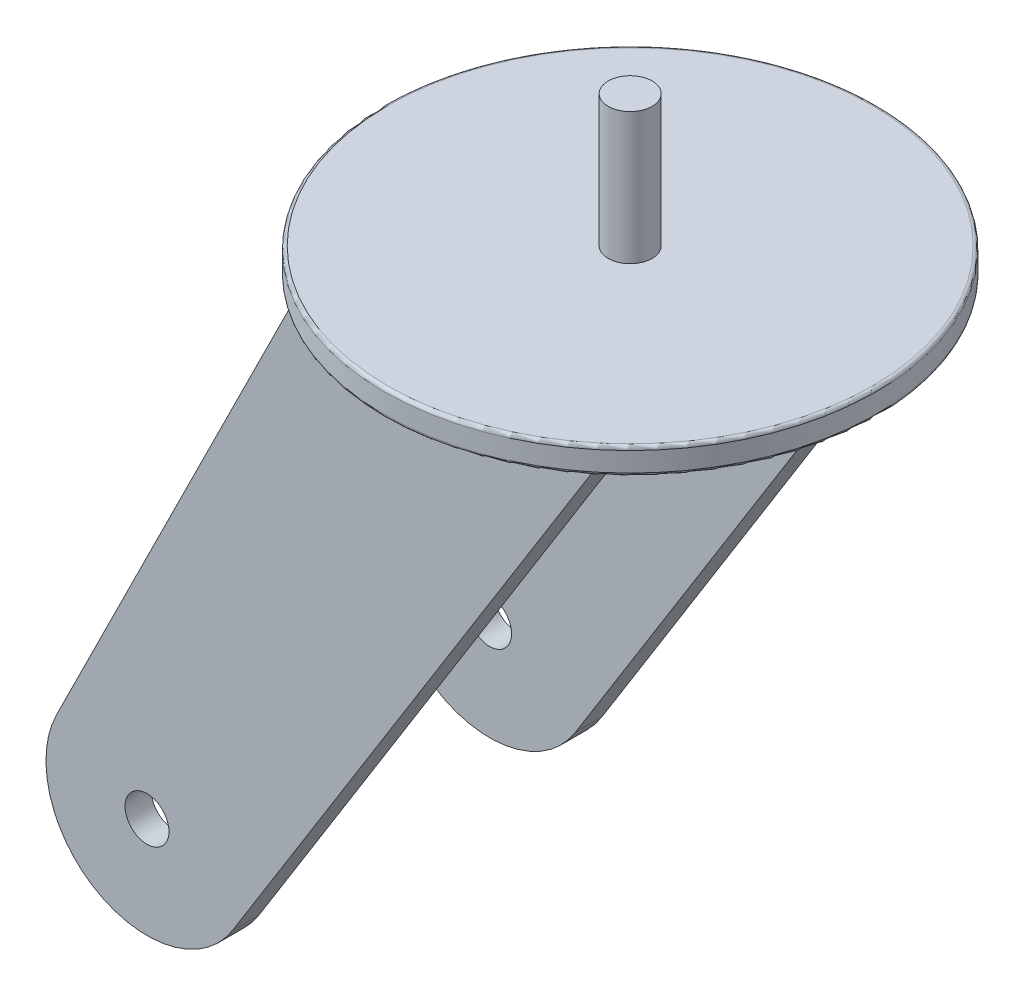
ISO-10303-21;
HEADER;
FILE_DESCRIPTION(('STEP AP214'),'2;1');
FILE_NAME('part.step','',(''),(''),'','','');
FILE_SCHEMA(('AUTOMOTIVE_DESIGN { 1 0 10303 214 1 1 1 1 }'));
ENDSEC;
DATA;
#1=APPLICATION_CONTEXT('core data for automotive mechanical design processes');
#2=APPLICATION_PROTOCOL_DEFINITION('international standard','automotive_design',2000,#1);
#3=PRODUCT_CONTEXT('',#1,'mechanical');
#4=PRODUCT('Part','Part','',(#3));
#5=PRODUCT_RELATED_PRODUCT_CATEGORY('part','',(#4));
#6=PRODUCT_DEFINITION_FORMATION('','',#4);
#7=PRODUCT_DEFINITION_CONTEXT('part definition',#1,'design');
#8=PRODUCT_DEFINITION('design','',#6,#7);
#9=PRODUCT_DEFINITION_SHAPE('','',#8);
#10=(LENGTH_UNIT() NAMED_UNIT(*) SI_UNIT(.MILLI.,.METRE.));
#11=(NAMED_UNIT(*) PLANE_ANGLE_UNIT() SI_UNIT($,.RADIAN.));
#12=(NAMED_UNIT(*) SI_UNIT($,.STERADIAN.) SOLID_ANGLE_UNIT());
#13=UNCERTAINTY_MEASURE_WITH_UNIT(LENGTH_MEASURE(1.E-05),#10,'distance_accuracy_value','');
#14=(GEOMETRIC_REPRESENTATION_CONTEXT(3) GLOBAL_UNCERTAINTY_ASSIGNED_CONTEXT((#13)) GLOBAL_UNIT_ASSIGNED_CONTEXT((#10,
#11,#12)) REPRESENTATION_CONTEXT('',''));
#15=CARTESIAN_POINT('',(0.,0.,0.));
#16=DIRECTION('',(0.,0.,1.));
#17=DIRECTION('',(1.,0.,0.));
#18=AXIS2_PLACEMENT_3D('',#15,#16,#17);
#19=CARTESIAN_POINT('',(0.,0.,0.));
#20=DIRECTION('',(0.,1.,0.));
#21=DIRECTION('',(0.,0.,1.));
#22=AXIS2_PLACEMENT_3D('',#19,#20,#21);
#23=PLANE('',#22);
#24=DIRECTION('',(0.,0.,1.));
#25=VECTOR('',#24,1.);
#26=CARTESIAN_POINT('',(43.18,0.,-53.34));
#27=LINE('',#26,#25);
#28=CARTESIAN_POINT('',(43.18,0.,-53.34));
#29=VERTEX_POINT('',#28);
#30=CARTESIAN_POINT('',(43.18,0.,-45.72));
#31=VERTEX_POINT('',#30);
#32=EDGE_CURVE('E55',#29,#31,#27,.T.);
#33=ORIENTED_EDGE('',*,*,#32,.F.);
#34=DIRECTION('',(-1.,0.,0.));
#35=VECTOR('',#34,1.);
#36=CARTESIAN_POINT('',(0.,0.,-53.34));
#37=LINE('',#36,#35);
#38=CARTESIAN_POINT('',(-43.18,0.,-53.34));
#39=VERTEX_POINT('',#38);
#40=EDGE_CURVE('E59',#29,#39,#37,.T.);
#41=ORIENTED_EDGE('',*,*,#40,.T.);
#42=DIRECTION('',(0.,0.,1.));
#43=VECTOR('',#42,1.);
#44=CARTESIAN_POINT('',(-43.18,0.,-53.34));
#45=LINE('',#44,#43);
#46=CARTESIAN_POINT('',(-43.18,0.,-45.72));
#47=VERTEX_POINT('',#46);
#48=EDGE_CURVE('E129',#39,#47,#45,.T.);
#49=ORIENTED_EDGE('',*,*,#48,.T.);
#50=DIRECTION('',(-1.,0.,0.));
#51=VECTOR('',#50,1.);
#52=CARTESIAN_POINT('',(0.,0.,-45.72));
#53=LINE('',#52,#51);
#54=EDGE_CURVE('E133',#31,#47,#53,.T.);
#55=ORIENTED_EDGE('',*,*,#54,.F.);
#56=EDGE_LOOP('',(#33,#41,#49,#55));
#57=FACE_BOUND('',#56,.T.);
#58=CARTESIAN_POINT('',(0.,0.,0.));
#59=DIRECTION('',(0.,1.,0.));
#60=DIRECTION('',(0.,0.,1.));
#61=AXIS2_PLACEMENT_3D('',#58,#59,#60);
#62=CIRCLE('',#61,70.1294);
#63=CARTESIAN_POINT('',(0.,0.,70.1294));
#64=VERTEX_POINT('',#63);
#65=EDGE_CURVE('E48',#64,#64,#62,.F.);
#66=ORIENTED_EDGE('',*,*,#65,.T.);
#67=EDGE_LOOP('',(#66));
#68=FACE_BOUND('',#67,.T.);
#69=DIRECTION('',(0.,0.,-1.));
#70=VECTOR('',#69,1.);
#71=CARTESIAN_POINT('',(-43.18,0.,53.34));
#72=LINE('',#71,#70);
#73=CARTESIAN_POINT('',(-43.18,0.,53.34));
#74=VERTEX_POINT('',#73);
#75=CARTESIAN_POINT('',(-43.18,0.,45.72));
#76=VERTEX_POINT('',#75);
#77=EDGE_CURVE('E199',#74,#76,#72,.T.);
#78=ORIENTED_EDGE('',*,*,#77,.F.);
#79=DIRECTION('',(-1.,0.,0.));
#80=VECTOR('',#79,1.);
#81=CARTESIAN_POINT('',(0.,0.,53.34));
#82=LINE('',#81,#80);
#83=CARTESIAN_POINT('',(43.18,0.,53.34));
#84=VERTEX_POINT('',#83);
#85=EDGE_CURVE('E162',#84,#74,#82,.T.);
#86=ORIENTED_EDGE('',*,*,#85,.F.);
#87=DIRECTION('',(0.,0.,-1.));
#88=VECTOR('',#87,1.);
#89=CARTESIAN_POINT('',(43.18,0.,53.34));
#90=LINE('',#89,#88);
#91=CARTESIAN_POINT('',(43.18,0.,45.72));
#92=VERTEX_POINT('',#91);
#93=EDGE_CURVE('E177',#84,#92,#90,.T.);
#94=ORIENTED_EDGE('',*,*,#93,.T.);
#95=DIRECTION('',(-1.,0.,0.));
#96=VECTOR('',#95,1.);
#97=CARTESIAN_POINT('',(0.,0.,45.72));
#98=LINE('',#97,#96);
#99=EDGE_CURVE('E167',#92,#76,#98,.T.);
#100=ORIENTED_EDGE('',*,*,#99,.T.);
#101=EDGE_LOOP('',(#78,#86,#94,#100));
#102=FACE_BOUND('',#101,.T.);
#103=ADVANCED_FACE('F39',(#57,#68,#102),#23,.F.);
#104=CARTESIAN_POINT('',(0.,7.62,0.));
#105=DIRECTION('',(0.,-1.,0.));
#106=DIRECTION('',(0.,0.,-1.));
#107=AXIS2_PLACEMENT_3D('',#104,#105,#106);
#108=CYLINDRICAL_SURFACE('',#107,71.12);
#109=CARTESIAN_POINT('',(0.,0.990599999999999,0.));
#110=DIRECTION('',(0.,1.,0.));
#111=DIRECTION('',(0.,0.,1.));
#112=AXIS2_PLACEMENT_3D('',#109,#110,#111);
#113=CIRCLE('',#112,71.12);
#114=CARTESIAN_POINT('',(0.,0.990599999999999,71.12));
#115=VERTEX_POINT('',#114);
#116=EDGE_CURVE('E207',#115,#115,#113,.T.);
#117=ORIENTED_EDGE('',*,*,#116,.T.);
#118=EDGE_LOOP('',(#117));
#119=FACE_BOUND('',#118,.T.);
#120=CARTESIAN_POINT('',(0.,6.6294,0.));
#121=DIRECTION('',(0.,1.,0.));
#122=DIRECTION('',(0.,0.,1.));
#123=AXIS2_PLACEMENT_3D('',#120,#121,#122);
#124=CIRCLE('',#123,71.12);
#125=CARTESIAN_POINT('',(0.,6.6294,71.12));
#126=VERTEX_POINT('',#125);
#127=EDGE_CURVE('E203',#126,#126,#124,.F.);
#128=ORIENTED_EDGE('',*,*,#127,.T.);
#129=EDGE_LOOP('',(#128));
#130=FACE_BOUND('',#129,.T.);
#131=ADVANCED_FACE('F222',(#119,#130),#108,.T.);
#132=CARTESIAN_POINT('',(0.,7.62,0.));
#133=DIRECTION('',(0.,1.,0.));
#134=DIRECTION('',(0.,0.,1.));
#135=AXIS2_PLACEMENT_3D('',#132,#133,#134);
#136=PLANE('',#135);
#137=CARTESIAN_POINT('',(0.,7.62,0.));
#138=DIRECTION('',(0.,1.,0.));
#139=DIRECTION('',(0.,0.,1.));
#140=AXIS2_PLACEMENT_3D('',#137,#138,#139);
#141=CIRCLE('',#140,6.35);
#142=CARTESIAN_POINT('',(0.,7.62,-6.35));
#143=VERTEX_POINT('',#142);
#144=EDGE_CURVE('E403',#143,#143,#141,.T.);
#145=ORIENTED_EDGE('',*,*,#144,.F.);
#146=EDGE_LOOP('',(#145));
#147=FACE_BOUND('',#146,.T.);
#148=CARTESIAN_POINT('',(0.,7.62,0.));
#149=DIRECTION('',(0.,1.,0.));
#150=DIRECTION('',(0.,0.,1.));
#151=AXIS2_PLACEMENT_3D('',#148,#149,#150);
#152=CIRCLE('',#151,70.1294);
#153=CARTESIAN_POINT('',(0.,7.62,70.1294));
#154=VERTEX_POINT('',#153);
#155=EDGE_CURVE('E11',#154,#154,#152,.T.);
#156=ORIENTED_EDGE('',*,*,#155,.T.);
#157=EDGE_LOOP('',(#156));
#158=FACE_BOUND('',#157,.T.);
#159=ADVANCED_FACE('F219',(#147,#158),#136,.T.);
#160=CARTESIAN_POINT('',(0.,0.990599999999999,0.));
#161=DIRECTION('',(0.,1.,0.));
#162=DIRECTION('',(0.,0.,1.));
#163=AXIS2_PLACEMENT_3D('',#160,#161,#162);
#164=TOROIDAL_SURFACE('',#163,70.1294,0.9906);
#165=ORIENTED_EDGE('',*,*,#65,.F.);
#166=EDGE_LOOP('',(#165));
#167=FACE_BOUND('',#166,.T.);
#168=ORIENTED_EDGE('',*,*,#116,.F.);
#169=EDGE_LOOP('',(#168));
#170=FACE_BOUND('',#169,.T.);
#171=ADVANCED_FACE('F216',(#167,#170),#164,.T.);
#172=CARTESIAN_POINT('',(0.,6.6294,0.));
#173=DIRECTION('',(0.,1.,0.));
#174=DIRECTION('',(0.,0.,1.));
#175=AXIS2_PLACEMENT_3D('',#172,#173,#174);
#176=TOROIDAL_SURFACE('',#175,70.1294,0.9906);
#177=ORIENTED_EDGE('',*,*,#127,.F.);
#178=EDGE_LOOP('',(#177));
#179=FACE_BOUND('',#178,.T.);
#180=ORIENTED_EDGE('',*,*,#155,.F.);
#181=EDGE_LOOP('',(#180));
#182=FACE_BOUND('',#181,.T.);
#183=ADVANCED_FACE('F41',(#179,#182),#176,.T.);
#184=CARTESIAN_POINT('',(-86.36,-152.4,53.34));
#185=DIRECTION('',(0.,0.,1.));
#186=DIRECTION('',(1.,0.,0.));
#187=AXIS2_PLACEMENT_3D('',#184,#185,#186);
#188=PLANE('',#187);
#189=ORIENTED_EDGE('',*,*,#85,.T.);
#190=DIRECTION('',(-0.445350899786596,-0.89535611689387,0.));
#191=VECTOR('',#190,1.);
#192=CARTESIAN_POINT('',(-43.18,0.,53.34));
#193=LINE('',#192,#191);
#194=CARTESIAN_POINT('',(-112.51335217447,-139.391300217234,53.34));
#195=VERTEX_POINT('',#194);
#196=EDGE_CURVE('E166',#74,#195,#193,.T.);
#197=ORIENTED_EDGE('',*,*,#196,.T.);
#198=CARTESIAN_POINT('',(-86.36,-152.4,53.34));
#199=DIRECTION('',(0.,0.,1.));
#200=DIRECTION('',(1.,0.,0.));
#201=AXIS2_PLACEMENT_3D('',#198,#199,#200);
#202=CIRCLE('',#201,29.21);
#203=CARTESIAN_POINT('',(-61.5796372167252,-167.86472503245,53.34));
#204=VERTEX_POINT('',#203);
#205=EDGE_CURVE('E170',#195,#204,#202,.T.);
#206=ORIENTED_EDGE('',*,*,#205,.T.);
#207=DIRECTION('',(0.529432558454303,0.848352029554082,0.));
#208=VECTOR('',#207,1.);
#209=CARTESIAN_POINT('',(43.18,0.,53.34));
#210=LINE('',#209,#208);
#211=EDGE_CURVE('E173',#204,#84,#210,.T.);
#212=ORIENTED_EDGE('',*,*,#211,.T.);
#213=EDGE_LOOP('',(#189,#197,#206,#212));
#214=FACE_BOUND('',#213,.T.);
#215=CARTESIAN_POINT('',(-86.36,-152.4,53.34));
#216=DIRECTION('',(0.,0.,1.));
#217=DIRECTION('',(1.,0.,0.));
#218=AXIS2_PLACEMENT_3D('',#215,#216,#217);
#219=CIRCLE('',#218,6.34999999999999);
#220=CARTESIAN_POINT('',(-80.01,-152.4,53.34));
#221=VERTEX_POINT('',#220);
#222=EDGE_CURVE('E154',#221,#221,#219,.T.);
#223=ORIENTED_EDGE('',*,*,#222,.F.);
#224=EDGE_LOOP('',(#223));
#225=FACE_BOUND('',#224,.T.);
#226=ADVANCED_FACE('F230',(#214,#225),#188,.T.);
#227=CARTESIAN_POINT('',(-86.36,-152.4,45.72));
#228=DIRECTION('',(0.,0.,1.));
#229=DIRECTION('',(1.,0.,0.));
#230=AXIS2_PLACEMENT_3D('',#227,#228,#229);
#231=PLANE('',#230);
#232=DIRECTION('',(-0.445350899786596,-0.89535611689387,0.));
#233=VECTOR('',#232,1.);
#234=CARTESIAN_POINT('',(-43.18,0.,45.72));
#235=LINE('',#234,#233);
#236=CARTESIAN_POINT('',(-112.51335217447,-139.391300217234,45.72));
#237=VERTEX_POINT('',#236);
#238=EDGE_CURVE('E158',#76,#237,#235,.T.);
#239=ORIENTED_EDGE('',*,*,#238,.F.);
#240=ORIENTED_EDGE('',*,*,#99,.F.);
#241=DIRECTION('',(0.529432558454303,0.848352029554082,0.));
#242=VECTOR('',#241,1.);
#243=CARTESIAN_POINT('',(43.18,0.,45.72));
#244=LINE('',#243,#242);
#245=CARTESIAN_POINT('',(-61.5796372167252,-167.86472503245,45.72));
#246=VERTEX_POINT('',#245);
#247=EDGE_CURVE('E183',#246,#92,#244,.T.);
#248=ORIENTED_EDGE('',*,*,#247,.F.);
#249=CARTESIAN_POINT('',(-86.36,-152.4,45.72));
#250=DIRECTION('',(0.,0.,1.));
#251=DIRECTION('',(1.,0.,0.));
#252=AXIS2_PLACEMENT_3D('',#249,#250,#251);
#253=CIRCLE('',#252,29.21);
#254=EDGE_CURVE('E180',#237,#246,#253,.T.);
#255=ORIENTED_EDGE('',*,*,#254,.F.);
#256=EDGE_LOOP('',(#239,#240,#248,#255));
#257=FACE_BOUND('',#256,.T.);
#258=CARTESIAN_POINT('',(-86.36,-152.4,45.72));
#259=DIRECTION('',(0.,0.,1.));
#260=DIRECTION('',(1.,0.,0.));
#261=AXIS2_PLACEMENT_3D('',#258,#259,#260);
#262=CIRCLE('',#261,6.34999999999999);
#263=CARTESIAN_POINT('',(-80.01,-152.4,45.72));
#264=VERTEX_POINT('',#263);
#265=EDGE_CURVE('E153',#264,#264,#262,.T.);
#266=ORIENTED_EDGE('',*,*,#265,.T.);
#267=EDGE_LOOP('',(#266));
#268=FACE_BOUND('',#267,.T.);
#269=ADVANCED_FACE('F272',(#257,#268),#231,.F.);
#270=CARTESIAN_POINT('',(-43.18,0.,53.34));
#271=DIRECTION('',(0.89535611689387,-0.445350899786596,0.));
#272=DIRECTION('',(0.445350899786596,0.89535611689387,0.));
#273=AXIS2_PLACEMENT_3D('',#270,#271,#272);
#274=PLANE('',#273);
#275=ORIENTED_EDGE('',*,*,#238,.T.);
#276=DIRECTION('',(0.,0.,-1.));
#277=VECTOR('',#276,1.);
#278=CARTESIAN_POINT('',(-112.51335217447,-139.391300217234,53.34));
#279=LINE('',#278,#277);
#280=EDGE_CURVE('E195',#195,#237,#279,.T.);
#281=ORIENTED_EDGE('',*,*,#280,.F.);
#282=ORIENTED_EDGE('',*,*,#196,.F.);
#283=ORIENTED_EDGE('',*,*,#77,.T.);
#284=EDGE_LOOP('',(#275,#281,#282,#283));
#285=FACE_BOUND('',#284,.T.);
#286=ADVANCED_FACE('F282',(#285),#274,.F.);
#287=CARTESIAN_POINT('',(-86.36,-152.4,53.34));
#288=DIRECTION('',(0.,0.,-1.));
#289=DIRECTION('',(-1.,0.,0.));
#290=AXIS2_PLACEMENT_3D('',#287,#288,#289);
#291=CYLINDRICAL_SURFACE('',#290,29.21);
#292=ORIENTED_EDGE('',*,*,#254,.T.);
#293=DIRECTION('',(0.,0.,-1.));
#294=VECTOR('',#293,1.);
#295=CARTESIAN_POINT('',(-61.5796372167252,-167.86472503245,53.34));
#296=LINE('',#295,#294);
#297=EDGE_CURVE('E191',#204,#246,#296,.T.);
#298=ORIENTED_EDGE('',*,*,#297,.F.);
#299=ORIENTED_EDGE('',*,*,#205,.F.);
#300=ORIENTED_EDGE('',*,*,#280,.T.);
#301=EDGE_LOOP('',(#292,#298,#299,#300));
#302=FACE_BOUND('',#301,.T.);
#303=ADVANCED_FACE('F292',(#302),#291,.T.);
#304=CARTESIAN_POINT('',(43.18,0.,53.34));
#305=DIRECTION('',(-0.848352029554082,0.529432558454303,0.));
#306=DIRECTION('',(-0.529432558454303,-0.848352029554082,0.));
#307=AXIS2_PLACEMENT_3D('',#304,#305,#306);
#308=PLANE('',#307);
#309=ORIENTED_EDGE('',*,*,#247,.T.);
#310=ORIENTED_EDGE('',*,*,#93,.F.);
#311=ORIENTED_EDGE('',*,*,#211,.F.);
#312=ORIENTED_EDGE('',*,*,#297,.T.);
#313=EDGE_LOOP('',(#309,#310,#311,#312));
#314=FACE_BOUND('',#313,.T.);
#315=ADVANCED_FACE('F301',(#314),#308,.F.);
#316=CARTESIAN_POINT('',(-86.36,-152.4,53.34));
#317=DIRECTION('',(0.,0.,-1.));
#318=DIRECTION('',(-1.,0.,0.));
#319=AXIS2_PLACEMENT_3D('',#316,#317,#318);
#320=CYLINDRICAL_SURFACE('',#319,6.34999999999999);
#321=ORIENTED_EDGE('',*,*,#222,.T.);
#322=EDGE_LOOP('',(#321));
#323=FACE_BOUND('',#322,.T.);
#324=ORIENTED_EDGE('',*,*,#265,.F.);
#325=EDGE_LOOP('',(#324));
#326=FACE_BOUND('',#325,.T.);
#327=ADVANCED_FACE('F310',(#323,#326),#320,.F.);
#328=CARTESIAN_POINT('',(43.18,0.,-53.34));
#329=DIRECTION('',(0.848352029554082,-0.529432558454303,0.));
#330=DIRECTION('',(0.529432558454303,0.848352029554082,0.));
#331=AXIS2_PLACEMENT_3D('',#328,#329,#330);
#332=PLANE('',#331);
#333=DIRECTION('',(0.529432558454303,0.848352029554082,0.));
#334=VECTOR('',#333,1.);
#335=CARTESIAN_POINT('',(43.18,0.,-45.72));
#336=LINE('',#335,#334);
#337=CARTESIAN_POINT('',(-61.5796372167252,-167.86472503245,-45.72));
#338=VERTEX_POINT('',#337);
#339=EDGE_CURVE('E108',#338,#31,#336,.T.);
#340=ORIENTED_EDGE('',*,*,#339,.F.);
#341=DIRECTION('',(0.,0.,1.));
#342=VECTOR('',#341,1.);
#343=CARTESIAN_POINT('',(-61.5796372167252,-167.86472503245,-53.34));
#344=LINE('',#343,#342);
#345=CARTESIAN_POINT('',(-61.5796372167252,-167.86472503245,-53.34));
#346=VERTEX_POINT('',#345);
#347=EDGE_CURVE('E103',#346,#338,#344,.T.);
#348=ORIENTED_EDGE('',*,*,#347,.F.);
#349=DIRECTION('',(0.529432558454303,0.848352029554082,0.));
#350=VECTOR('',#349,1.);
#351=CARTESIAN_POINT('',(43.18,0.,-53.34));
#352=LINE('',#351,#350);
#353=EDGE_CURVE('E106',#346,#29,#352,.T.);
#354=ORIENTED_EDGE('',*,*,#353,.T.);
#355=ORIENTED_EDGE('',*,*,#32,.T.);
#356=EDGE_LOOP('',(#340,#348,#354,#355));
#357=FACE_BOUND('',#356,.T.);
#358=ADVANCED_FACE('F105',(#357),#332,.T.);
#359=CARTESIAN_POINT('',(-86.36,-152.4,-53.34));
#360=DIRECTION('',(0.,0.,1.));
#361=DIRECTION('',(1.,0.,0.));
#362=AXIS2_PLACEMENT_3D('',#359,#360,#361);
#363=CYLINDRICAL_SURFACE('',#362,29.21);
#364=CARTESIAN_POINT('',(-86.36,-152.4,-45.72));
#365=DIRECTION('',(0.,0.,1.));
#366=DIRECTION('',(1.,0.,0.));
#367=AXIS2_PLACEMENT_3D('',#364,#365,#366);
#368=CIRCLE('',#367,29.21);
#369=CARTESIAN_POINT('',(-112.51335217447,-139.391300217234,-45.72));
#370=VERTEX_POINT('',#369);
#371=EDGE_CURVE('E140',#370,#338,#368,.T.);
#372=ORIENTED_EDGE('',*,*,#371,.F.);
#373=DIRECTION('',(0.,0.,1.));
#374=VECTOR('',#373,1.);
#375=CARTESIAN_POINT('',(-112.51335217447,-139.391300217234,-53.34));
#376=LINE('',#375,#374);
#377=CARTESIAN_POINT('',(-112.51335217447,-139.391300217234,-53.34));
#378=VERTEX_POINT('',#377);
#379=EDGE_CURVE('E114',#378,#370,#376,.T.);
#380=ORIENTED_EDGE('',*,*,#379,.F.);
#381=CARTESIAN_POINT('',(-86.36,-152.4,-53.34));
#382=DIRECTION('',(0.,0.,1.));
#383=DIRECTION('',(1.,0.,0.));
#384=AXIS2_PLACEMENT_3D('',#381,#382,#383);
#385=CIRCLE('',#384,29.21);
#386=EDGE_CURVE('E120',#378,#346,#385,.T.);
#387=ORIENTED_EDGE('',*,*,#386,.T.);
#388=ORIENTED_EDGE('',*,*,#347,.T.);
#389=EDGE_LOOP('',(#372,#380,#387,#388));
#390=FACE_BOUND('',#389,.T.);
#391=ADVANCED_FACE('F124',(#390),#363,.T.);
#392=CARTESIAN_POINT('',(-43.18,0.,-53.34));
#393=DIRECTION('',(-0.89535611689387,0.445350899786596,0.));
#394=DIRECTION('',(-0.445350899786596,-0.89535611689387,0.));
#395=AXIS2_PLACEMENT_3D('',#392,#393,#394);
#396=PLANE('',#395);
#397=DIRECTION('',(-0.445350899786596,-0.89535611689387,0.));
#398=VECTOR('',#397,1.);
#399=CARTESIAN_POINT('',(-43.18,0.,-45.72));
#400=LINE('',#399,#398);
#401=EDGE_CURVE('E143',#47,#370,#400,.T.);
#402=ORIENTED_EDGE('',*,*,#401,.F.);
#403=ORIENTED_EDGE('',*,*,#48,.F.);
#404=DIRECTION('',(-0.445350899786596,-0.89535611689387,0.));
#405=VECTOR('',#404,1.);
#406=CARTESIAN_POINT('',(-43.18,0.,-53.34));
#407=LINE('',#406,#405);
#408=EDGE_CURVE('E126',#39,#378,#407,.T.);
#409=ORIENTED_EDGE('',*,*,#408,.T.);
#410=ORIENTED_EDGE('',*,*,#379,.T.);
#411=EDGE_LOOP('',(#402,#403,#409,#410));
#412=FACE_BOUND('',#411,.T.);
#413=ADVANCED_FACE('F333',(#412),#396,.T.);
#414=CARTESIAN_POINT('',(-86.36,-152.4,-53.34));
#415=DIRECTION('',(0.,0.,-1.));
#416=DIRECTION('',(1.,0.,0.));
#417=AXIS2_PLACEMENT_3D('',#414,#415,#416);
#418=PLANE('',#417);
#419=CARTESIAN_POINT('',(-86.36,-152.4,-53.34));
#420=DIRECTION('',(0.,0.,1.));
#421=DIRECTION('',(1.,0.,0.));
#422=AXIS2_PLACEMENT_3D('',#419,#420,#421);
#423=CIRCLE('',#422,6.34999999999999);
#424=CARTESIAN_POINT('',(-80.01,-152.4,-53.34));
#425=VERTEX_POINT('',#424);
#426=EDGE_CURVE('E137',#425,#425,#423,.T.);
#427=ORIENTED_EDGE('',*,*,#426,.T.);
#428=EDGE_LOOP('',(#427));
#429=FACE_BOUND('',#428,.T.);
#430=ORIENTED_EDGE('',*,*,#40,.F.);
#431=ORIENTED_EDGE('',*,*,#353,.F.);
#432=ORIENTED_EDGE('',*,*,#386,.F.);
#433=ORIENTED_EDGE('',*,*,#408,.F.);
#434=EDGE_LOOP('',(#430,#431,#432,#433));
#435=FACE_BOUND('',#434,.T.);
#436=ADVANCED_FACE('F118',(#429,#435),#418,.T.);
#437=CARTESIAN_POINT('',(-86.36,-152.4,-45.72));
#438=DIRECTION('',(0.,0.,-1.));
#439=DIRECTION('',(1.,0.,0.));
#440=AXIS2_PLACEMENT_3D('',#437,#438,#439);
#441=PLANE('',#440);
#442=CARTESIAN_POINT('',(-86.36,-152.4,-45.72));
#443=DIRECTION('',(0.,0.,1.));
#444=DIRECTION('',(1.,0.,0.));
#445=AXIS2_PLACEMENT_3D('',#442,#443,#444);
#446=CIRCLE('',#445,6.34999999999999);
#447=CARTESIAN_POINT('',(-80.01,-152.4,-45.72));
#448=VERTEX_POINT('',#447);
#449=EDGE_CURVE('E402',#448,#448,#446,.T.);
#450=ORIENTED_EDGE('',*,*,#449,.F.);
#451=EDGE_LOOP('',(#450));
#452=FACE_BOUND('',#451,.T.);
#453=ORIENTED_EDGE('',*,*,#54,.T.);
#454=ORIENTED_EDGE('',*,*,#401,.T.);
#455=ORIENTED_EDGE('',*,*,#371,.T.);
#456=ORIENTED_EDGE('',*,*,#339,.T.);
#457=EDGE_LOOP('',(#453,#454,#455,#456));
#458=FACE_BOUND('',#457,.T.);
#459=ADVANCED_FACE('F347',(#452,#458),#441,.F.);
#460=CARTESIAN_POINT('',(-86.36,-152.4,-53.34));
#461=DIRECTION('',(0.,0.,1.));
#462=DIRECTION('',(1.,0.,0.));
#463=AXIS2_PLACEMENT_3D('',#460,#461,#462);
#464=CYLINDRICAL_SURFACE('',#463,6.34999999999999);
#465=ORIENTED_EDGE('',*,*,#426,.F.);
#466=EDGE_LOOP('',(#465));
#467=FACE_BOUND('',#466,.T.);
#468=ORIENTED_EDGE('',*,*,#449,.T.);
#469=EDGE_LOOP('',(#468));
#470=FACE_BOUND('',#469,.T.);
#471=ADVANCED_FACE('F355',(#467,#470),#464,.F.);
#472=CARTESIAN_POINT('',(0.,45.72,0.));
#473=DIRECTION('',(0.,-1.,0.));
#474=DIRECTION('',(0.,0.,-1.));
#475=AXIS2_PLACEMENT_3D('',#472,#473,#474);
#476=CYLINDRICAL_SURFACE('',#475,6.35);
#477=CARTESIAN_POINT('',(0.,45.72,0.));
#478=DIRECTION('',(0.,1.,0.));
#479=DIRECTION('',(0.,0.,1.));
#480=AXIS2_PLACEMENT_3D('',#477,#478,#479);
#481=CIRCLE('',#480,6.35);
#482=CARTESIAN_POINT('',(0.,45.72,-6.35));
#483=VERTEX_POINT('',#482);
#484=EDGE_CURVE('E400',#483,#483,#481,.T.);
#485=CARTESIAN_POINT('',(0.,45.72,-6.35));
#486=CARTESIAN_POINT('',(0.,45.323125,-6.35));
#487=CARTESIAN_POINT('',(0.,44.92625,-6.35));
#488=CARTESIAN_POINT('',(0.,44.1325,-6.35));
#489=CARTESIAN_POINT('',(0.,43.735625,-6.35));
#490=CARTESIAN_POINT('',(0.,42.941875,-6.35));
#491=CARTESIAN_POINT('',(0.,42.545,-6.35));
#492=CARTESIAN_POINT('',(0.,41.75125,-6.35));
#493=CARTESIAN_POINT('',(0.,41.354375,-6.35));
#494=CARTESIAN_POINT('',(0.,40.560625,-6.35));
#495=CARTESIAN_POINT('',(0.,40.16375,-6.35));
#496=CARTESIAN_POINT('',(0.,39.37,-6.35));
#497=CARTESIAN_POINT('',(0.,38.973125,-6.35));
#498=CARTESIAN_POINT('',(0.,38.179375,-6.35));
#499=CARTESIAN_POINT('',(0.,37.7825,-6.35));
#500=CARTESIAN_POINT('',(0.,36.98875,-6.35));
#501=CARTESIAN_POINT('',(0.,36.591875,-6.35));
#502=CARTESIAN_POINT('',(0.,35.798125,-6.35));
#503=CARTESIAN_POINT('',(0.,35.40125,-6.35));
#504=CARTESIAN_POINT('',(0.,34.6075,-6.35));
#505=CARTESIAN_POINT('',(0.,34.210625,-6.35));
#506=CARTESIAN_POINT('',(0.,33.416875,-6.35));
#507=CARTESIAN_POINT('',(0.,33.02,-6.35));
#508=CARTESIAN_POINT('',(0.,32.22625,-6.35));
#509=CARTESIAN_POINT('',(0.,31.829375,-6.35));
#510=CARTESIAN_POINT('',(0.,31.035625,-6.35));
#511=CARTESIAN_POINT('',(0.,30.63875,-6.35));
#512=CARTESIAN_POINT('',(0.,29.845,-6.35));
#513=CARTESIAN_POINT('',(0.,29.448125,-6.35));
#514=CARTESIAN_POINT('',(0.,28.654375,-6.35));
#515=CARTESIAN_POINT('',(0.,28.2575,-6.35));
#516=CARTESIAN_POINT('',(0.,27.46375,-6.35));
#517=CARTESIAN_POINT('',(0.,27.066875,-6.35));
#518=CARTESIAN_POINT('',(0.,26.273125,-6.35));
#519=CARTESIAN_POINT('',(0.,25.87625,-6.35));
#520=CARTESIAN_POINT('',(0.,25.0825,-6.35));
#521=CARTESIAN_POINT('',(0.,24.685625,-6.35));
#522=CARTESIAN_POINT('',(0.,23.891875,-6.35));
#523=CARTESIAN_POINT('',(0.,23.495,-6.35));
#524=CARTESIAN_POINT('',(0.,22.70125,-6.35));
#525=CARTESIAN_POINT('',(0.,22.304375,-6.35));
#526=CARTESIAN_POINT('',(0.,21.510625,-6.35));
#527=CARTESIAN_POINT('',(0.,21.11375,-6.35));
#528=CARTESIAN_POINT('',(0.,20.32,-6.35));
#529=CARTESIAN_POINT('',(0.,19.923125,-6.35));
#530=CARTESIAN_POINT('',(0.,19.129375,-6.35));
#531=CARTESIAN_POINT('',(0.,18.7325,-6.35));
#532=CARTESIAN_POINT('',(0.,17.93875,-6.35));
#533=CARTESIAN_POINT('',(0.,17.541875,-6.35));
#534=CARTESIAN_POINT('',(0.,16.748125,-6.35));
#535=CARTESIAN_POINT('',(0.,16.35125,-6.35));
#536=CARTESIAN_POINT('',(0.,15.5575,-6.35));
#537=CARTESIAN_POINT('',(0.,15.160625,-6.35));
#538=CARTESIAN_POINT('',(0.,14.366875,-6.35));
#539=CARTESIAN_POINT('',(0.,13.97,-6.35));
#540=CARTESIAN_POINT('',(0.,13.17625,-6.35));
#541=CARTESIAN_POINT('',(0.,12.779375,-6.35));
#542=CARTESIAN_POINT('',(0.,11.985625,-6.35));
#543=CARTESIAN_POINT('',(0.,11.58875,-6.35));
#544=CARTESIAN_POINT('',(0.,10.795,-6.35));
#545=CARTESIAN_POINT('',(0.,10.398125,-6.35));
#546=CARTESIAN_POINT('',(0.,9.604375,-6.35));
#547=CARTESIAN_POINT('',(0.,9.2075,-6.35));
#548=CARTESIAN_POINT('',(0.,8.41375,-6.35));
#549=CARTESIAN_POINT('',(0.,8.016875,-6.35));
#550=CARTESIAN_POINT('',(0.,7.62,-6.35));
#551=B_SPLINE_CURVE_WITH_KNOTS('',3,(#485,#486,#487,#488,#489,#490,#491,#492,#493,#494,#495,
#496,#497,#498,#499,#500,#501,#502,#503,#504,#505,#506,#507,#508,#509,#510,#511,#512,#513,#514,
#515,#516,#517,#518,#519,#520,#521,#522,#523,#524,#525,#526,#527,#528,#529,#530,#531,#532,#533,
#534,#535,#536,#537,#538,#539,#540,#541,#542,#543,#544,#545,#546,#547,#548,#549,#550),
.UNSPECIFIED.,.F.,.F.,(4,2,2,2,2,2,2,2,2,2,2,2,2,2,2,2,2,2,2,2,2,2,2,2,2,2,2,2,2,2,2,2,4),(0.,
1.19062499999999,2.38124999999999,3.571875,4.7625,5.953125,7.14375,8.33437499999999,
9.52499999999999,10.715625,11.90625,13.096875,14.2875,15.478125,16.66875,17.859375,19.05,
20.240625,21.43125,22.621875,23.8125,25.003125,26.19375,27.384375,28.575,29.765625,30.95625,
32.146875,33.3375,34.528125,35.71875,36.909375,38.1),.UNSPECIFIED.);
#552=EDGE_CURVE('BSEAM363',#483,#143,#551,.T.);
#553=ORIENTED_EDGE('',*,*,#484,.F.);
#554=ORIENTED_EDGE('',*,*,#144,.T.);
#555=ORIENTED_EDGE('',*,*,#552,.T.);
#556=ORIENTED_EDGE('',*,*,#552,.F.);
#557=EDGE_LOOP('',(#553,#555,#554,#556));
#558=FACE_BOUND('',#557,.T.);
#559=ADVANCED_FACE('F363',(#558),#476,.T.);
#560=CARTESIAN_POINT('',(0.,45.72,0.));
#561=DIRECTION('',(0.,1.,0.));
#562=DIRECTION('',(0.,0.,1.));
#563=AXIS2_PLACEMENT_3D('',#560,#561,#562);
#564=PLANE('',#563);
#565=ORIENTED_EDGE('',*,*,#484,.T.);
#566=EDGE_LOOP('',(#565));
#567=FACE_BOUND('',#566,.T.);
#568=ADVANCED_FACE('F371',(#567),#564,.T.);
#569=CLOSED_SHELL('',(#103,#131,#159,#171,#183,#226,#269,#286,#303,#315,#327,#358,#391,#413,
#436,#459,#471,#559,#568));
#570=MANIFOLD_SOLID_BREP('B2',#569);
#571=ADVANCED_BREP_SHAPE_REPRESENTATION('',(#18,#570),#14);
#572=SHAPE_DEFINITION_REPRESENTATION(#9,#571);
ENDSEC;
END-ISO-10303-21;
